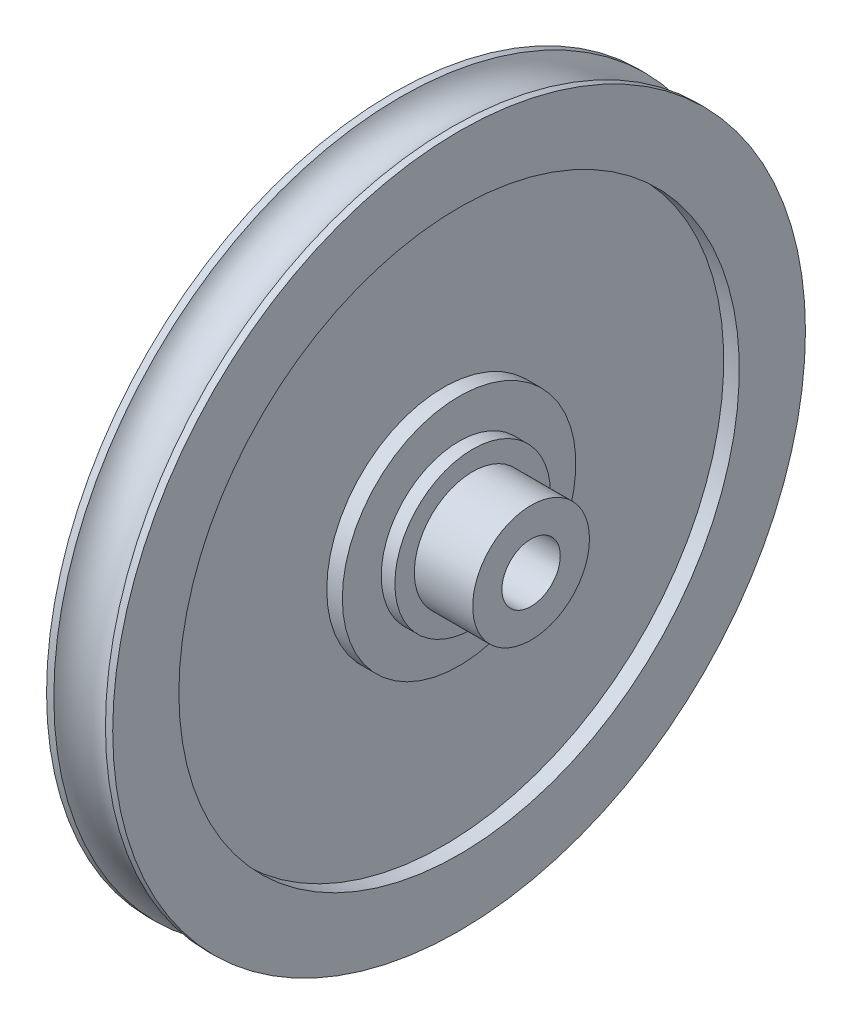
ISO-10303-21;
HEADER;
FILE_DESCRIPTION(('STEP AP214'),'2;1');
FILE_NAME('part.step','',(''),(''),'','','');
FILE_SCHEMA(('AUTOMOTIVE_DESIGN { 1 0 10303 214 1 1 1 1 }'));
ENDSEC;
DATA;
#1=APPLICATION_CONTEXT('core data for automotive mechanical design processes');
#2=APPLICATION_PROTOCOL_DEFINITION('international standard','automotive_design',2000,#1);
#3=PRODUCT_CONTEXT('',#1,'mechanical');
#4=PRODUCT('Part','Part','',(#3));
#5=PRODUCT_RELATED_PRODUCT_CATEGORY('part','',(#4));
#6=PRODUCT_DEFINITION_FORMATION('','',#4);
#7=PRODUCT_DEFINITION_CONTEXT('part definition',#1,'design');
#8=PRODUCT_DEFINITION('design','',#6,#7);
#9=PRODUCT_DEFINITION_SHAPE('','',#8);
#10=(LENGTH_UNIT() NAMED_UNIT(*) SI_UNIT(.MILLI.,.METRE.));
#11=(NAMED_UNIT(*) PLANE_ANGLE_UNIT() SI_UNIT($,.RADIAN.));
#12=(NAMED_UNIT(*) SI_UNIT($,.STERADIAN.) SOLID_ANGLE_UNIT());
#13=UNCERTAINTY_MEASURE_WITH_UNIT(LENGTH_MEASURE(1.E-05),#10,'distance_accuracy_value','');
#14=(GEOMETRIC_REPRESENTATION_CONTEXT(3) GLOBAL_UNCERTAINTY_ASSIGNED_CONTEXT((#13)) GLOBAL_UNIT_ASSIGNED_CONTEXT((#10,
#11,#12)) REPRESENTATION_CONTEXT('',''));
#15=CARTESIAN_POINT('',(0.,0.,0.));
#16=DIRECTION('',(0.,0.,1.));
#17=DIRECTION('',(1.,0.,0.));
#18=AXIS2_PLACEMENT_3D('',#15,#16,#17);
#19=CARTESIAN_POINT('',(-1.7,0.,0.));
#20=DIRECTION('',(1.,0.,0.));
#21=DIRECTION('',(0.,0.,-1.));
#22=AXIS2_PLACEMENT_3D('',#19,#20,#21);
#23=PLANE('',#22);
#24=CARTESIAN_POINT('',(-1.7,0.,0.));
#25=DIRECTION('',(1.,0.,0.));
#26=DIRECTION('',(0.,0.,-1.));
#27=AXIS2_PLACEMENT_3D('',#24,#25,#26);
#28=CIRCLE('',#27,4.);
#29=CARTESIAN_POINT('',(-1.7,0.,-4.));
#30=VERTEX_POINT('',#29);
#31=EDGE_CURVE('E85',#30,#30,#28,.T.);
#32=ORIENTED_EDGE('',*,*,#31,.T.);
#33=EDGE_LOOP('',(#32));
#34=FACE_BOUND('',#33,.T.);
#35=CARTESIAN_POINT('',(-1.7,0.,0.));
#36=DIRECTION('',(1.,0.,0.));
#37=DIRECTION('',(0.,0.,-1.));
#38=AXIS2_PLACEMENT_3D('',#35,#36,#37);
#39=CIRCLE('',#38,17.8);
#40=CARTESIAN_POINT('',(-1.7,0.,-17.8));
#41=VERTEX_POINT('',#40);
#42=EDGE_CURVE('E105',#41,#41,#39,.T.);
#43=ORIENTED_EDGE('',*,*,#42,.F.);
#44=EDGE_LOOP('',(#43));
#45=FACE_BOUND('',#44,.T.);
#46=ADVANCED_FACE('F38',(#34,#45),#23,.F.);
#47=CARTESIAN_POINT('',(1.7,0.,0.));
#48=DIRECTION('',(-1.,0.,0.));
#49=DIRECTION('',(0.,0.,1.));
#50=AXIS2_PLACEMENT_3D('',#47,#48,#49);
#51=PLANE('',#50);
#52=CARTESIAN_POINT('',(1.7,0.,0.));
#53=DIRECTION('',(-1.,0.,0.));
#54=DIRECTION('',(0.,0.,1.));
#55=AXIS2_PLACEMENT_3D('',#52,#53,#54);
#56=CIRCLE('',#55,14.4);
#57=CARTESIAN_POINT('',(1.7,0.,14.4));
#58=VERTEX_POINT('',#57);
#59=EDGE_CURVE('E69',#58,#58,#56,.T.);
#60=ORIENTED_EDGE('',*,*,#59,.T.);
#61=EDGE_LOOP('',(#60));
#62=FACE_BOUND('',#61,.T.);
#63=CARTESIAN_POINT('',(1.7,0.,0.));
#64=DIRECTION('',(-1.,0.,0.));
#65=DIRECTION('',(0.,0.,1.));
#66=AXIS2_PLACEMENT_3D('',#63,#64,#65);
#67=CIRCLE('',#66,17.8);
#68=CARTESIAN_POINT('',(1.7,0.,17.8));
#69=VERTEX_POINT('',#68);
#70=EDGE_CURVE('E42',#69,#69,#67,.T.);
#71=ORIENTED_EDGE('',*,*,#70,.F.);
#72=EDGE_LOOP('',(#71));
#73=FACE_BOUND('',#72,.T.);
#74=ADVANCED_FACE('F117',(#62,#73),#51,.F.);
#75=CARTESIAN_POINT('',(1.7,0.,0.));
#76=DIRECTION('',(-1.,0.,0.));
#77=DIRECTION('',(0.,0.,1.));
#78=AXIS2_PLACEMENT_3D('',#75,#76,#77);
#79=PLANE('',#78);
#80=CARTESIAN_POINT('',(1.7,0.,0.));
#81=DIRECTION('',(-1.,0.,0.));
#82=DIRECTION('',(0.,0.,1.));
#83=AXIS2_PLACEMENT_3D('',#80,#81,#82);
#84=CIRCLE('',#83,6.);
#85=CARTESIAN_POINT('',(1.7,0.,6.));
#86=VERTEX_POINT('',#85);
#87=EDGE_CURVE('E57',#86,#86,#84,.T.);
#88=ORIENTED_EDGE('',*,*,#87,.F.);
#89=EDGE_LOOP('',(#88));
#90=FACE_BOUND('',#89,.T.);
#91=CARTESIAN_POINT('',(1.7,0.,0.));
#92=DIRECTION('',(-1.,0.,0.));
#93=DIRECTION('',(0.,0.,1.));
#94=AXIS2_PLACEMENT_3D('',#91,#92,#93);
#95=CIRCLE('',#94,4.);
#96=CARTESIAN_POINT('',(1.7,0.,4.));
#97=VERTEX_POINT('',#96);
#98=EDGE_CURVE('E46',#97,#97,#95,.F.);
#99=ORIENTED_EDGE('',*,*,#98,.F.);
#100=EDGE_LOOP('',(#99));
#101=FACE_BOUND('',#100,.T.);
#102=ADVANCED_FACE('F119',(#90,#101),#79,.F.);
#103=CARTESIAN_POINT('',(-1.7,0.,0.));
#104=DIRECTION('',(-1.,0.,0.));
#105=DIRECTION('',(0.,0.,1.));
#106=AXIS2_PLACEMENT_3D('',#103,#104,#105);
#107=CYLINDRICAL_SURFACE('',#106,6.);
#108=CARTESIAN_POINT('',(0.9,0.,0.));
#109=DIRECTION('',(-1.,0.,0.));
#110=DIRECTION('',(0.,0.,1.));
#111=AXIS2_PLACEMENT_3D('',#108,#109,#110);
#112=CIRCLE('',#111,6.);
#113=CARTESIAN_POINT('',(0.9,0.,6.));
#114=VERTEX_POINT('',#113);
#115=EDGE_CURVE('E61',#114,#114,#112,.T.);
#116=ORIENTED_EDGE('',*,*,#115,.F.);
#117=EDGE_LOOP('',(#116));
#118=FACE_BOUND('',#117,.T.);
#119=ORIENTED_EDGE('',*,*,#87,.T.);
#120=EDGE_LOOP('',(#119));
#121=FACE_BOUND('',#120,.T.);
#122=ADVANCED_FACE('F127',(#118,#121),#107,.T.);
#123=CARTESIAN_POINT('',(0.9,0.,0.));
#124=DIRECTION('',(-1.,0.,0.));
#125=DIRECTION('',(0.,0.,1.));
#126=AXIS2_PLACEMENT_3D('',#123,#124,#125);
#127=PLANE('',#126);
#128=CARTESIAN_POINT('',(0.9,0.,0.));
#129=DIRECTION('',(-1.,0.,0.));
#130=DIRECTION('',(0.,0.,1.));
#131=AXIS2_PLACEMENT_3D('',#128,#129,#130);
#132=CIRCLE('',#131,14.4);
#133=CARTESIAN_POINT('',(0.9,0.,14.4));
#134=VERTEX_POINT('',#133);
#135=EDGE_CURVE('E65',#134,#134,#132,.T.);
#136=ORIENTED_EDGE('',*,*,#135,.F.);
#137=EDGE_LOOP('',(#136));
#138=FACE_BOUND('',#137,.T.);
#139=ORIENTED_EDGE('',*,*,#115,.T.);
#140=EDGE_LOOP('',(#139));
#141=FACE_BOUND('',#140,.T.);
#142=ADVANCED_FACE('F140',(#138,#141),#127,.F.);
#143=CARTESIAN_POINT('',(-1.7,0.,0.));
#144=DIRECTION('',(-1.,0.,0.));
#145=DIRECTION('',(0.,0.,1.));
#146=AXIS2_PLACEMENT_3D('',#143,#144,#145);
#147=CYLINDRICAL_SURFACE('',#146,14.4);
#148=ORIENTED_EDGE('',*,*,#59,.F.);
#149=EDGE_LOOP('',(#148));
#150=FACE_BOUND('',#149,.T.);
#151=ORIENTED_EDGE('',*,*,#135,.T.);
#152=EDGE_LOOP('',(#151));
#153=FACE_BOUND('',#152,.T.);
#154=ADVANCED_FACE('F136',(#150,#153),#147,.F.);
#155=CARTESIAN_POINT('',(2.4,0.,0.));
#156=DIRECTION('',(-1.,0.,0.));
#157=DIRECTION('',(0.,0.,1.));
#158=AXIS2_PLACEMENT_3D('',#155,#156,#157);
#159=CYLINDRICAL_SURFACE('',#158,4.);
#160=CARTESIAN_POINT('',(2.4,0.,0.));
#161=DIRECTION('',(1.,0.,0.));
#162=DIRECTION('',(0.,0.,-1.));
#163=AXIS2_PLACEMENT_3D('',#160,#161,#162);
#164=CIRCLE('',#163,4.);
#165=CARTESIAN_POINT('',(2.4,0.,-4.));
#166=VERTEX_POINT('',#165);
#167=EDGE_CURVE('E80',#166,#166,#164,.T.);
#168=ORIENTED_EDGE('',*,*,#167,.F.);
#169=EDGE_LOOP('',(#168));
#170=FACE_BOUND('',#169,.T.);
#171=ORIENTED_EDGE('',*,*,#98,.T.);
#172=EDGE_LOOP('',(#171));
#173=FACE_BOUND('',#172,.T.);
#174=ADVANCED_FACE('F139',(#170,#173),#159,.T.);
#175=CARTESIAN_POINT('',(2.4,0.,0.));
#176=DIRECTION('',(1.,0.,0.));
#177=DIRECTION('',(0.,0.,-1.));
#178=AXIS2_PLACEMENT_3D('',#175,#176,#177);
#179=PLANE('',#178);
#180=CARTESIAN_POINT('',(2.4,0.,0.));
#181=DIRECTION('',(1.,0.,0.));
#182=DIRECTION('',(0.,0.,-1.));
#183=AXIS2_PLACEMENT_3D('',#180,#181,#182);
#184=CIRCLE('',#183,3.);
#185=CARTESIAN_POINT('',(2.4,0.,-3.));
#186=VERTEX_POINT('',#185);
#187=EDGE_CURVE('E51',#186,#186,#184,.F.);
#188=ORIENTED_EDGE('',*,*,#187,.T.);
#189=EDGE_LOOP('',(#188));
#190=FACE_BOUND('',#189,.T.);
#191=ORIENTED_EDGE('',*,*,#167,.T.);
#192=EDGE_LOOP('',(#191));
#193=FACE_BOUND('',#192,.T.);
#194=ADVANCED_FACE('F157',(#190,#193),#179,.T.);
#195=CARTESIAN_POINT('',(5.4,0.,0.));
#196=DIRECTION('',(1.,0.,0.));
#197=DIRECTION('',(0.,0.,-1.));
#198=AXIS2_PLACEMENT_3D('',#195,#196,#197);
#199=PLANE('',#198);
#200=CARTESIAN_POINT('',(5.4,0.,0.));
#201=DIRECTION('',(1.,0.,0.));
#202=DIRECTION('',(0.,0.,-1.));
#203=AXIS2_PLACEMENT_3D('',#200,#201,#202);
#204=CIRCLE('',#203,1.5);
#205=CARTESIAN_POINT('',(5.4,0.,-1.5));
#206=VERTEX_POINT('',#205);
#207=EDGE_CURVE('E93',#206,#206,#204,.T.);
#208=ORIENTED_EDGE('',*,*,#207,.F.);
#209=EDGE_LOOP('',(#208));
#210=FACE_BOUND('',#209,.T.);
#211=CARTESIAN_POINT('',(5.4,0.,0.));
#212=DIRECTION('',(1.,0.,0.));
#213=DIRECTION('',(0.,0.,-1.));
#214=AXIS2_PLACEMENT_3D('',#211,#212,#213);
#215=CIRCLE('',#214,3.);
#216=CARTESIAN_POINT('',(5.4,0.,-3.));
#217=VERTEX_POINT('',#216);
#218=EDGE_CURVE('E76',#217,#217,#215,.T.);
#219=ORIENTED_EDGE('',*,*,#218,.T.);
#220=EDGE_LOOP('',(#219));
#221=FACE_BOUND('',#220,.T.);
#222=ADVANCED_FACE('F163',(#210,#221),#199,.T.);
#223=CARTESIAN_POINT('',(-5.4,0.,0.));
#224=DIRECTION('',(1.,0.,0.));
#225=DIRECTION('',(0.,0.,-1.));
#226=AXIS2_PLACEMENT_3D('',#223,#224,#225);
#227=CYLINDRICAL_SURFACE('',#226,3.);
#228=CARTESIAN_POINT('',(2.4,0.,-3.));
#229=CARTESIAN_POINT('',(2.43125,0.,-3.));
#230=CARTESIAN_POINT('',(2.4625,0.,-3.));
#231=CARTESIAN_POINT('',(2.525,0.,-3.));
#232=CARTESIAN_POINT('',(2.55625,0.,-3.));
#233=CARTESIAN_POINT('',(2.61875,0.,-3.));
#234=CARTESIAN_POINT('',(2.65,0.,-3.));
#235=CARTESIAN_POINT('',(2.7125,0.,-3.));
#236=CARTESIAN_POINT('',(2.74375,0.,-3.));
#237=CARTESIAN_POINT('',(2.80625,0.,-3.));
#238=CARTESIAN_POINT('',(2.8375,0.,-3.));
#239=CARTESIAN_POINT('',(2.9,0.,-3.));
#240=CARTESIAN_POINT('',(2.93125,0.,-3.));
#241=CARTESIAN_POINT('',(2.99375,0.,-3.));
#242=CARTESIAN_POINT('',(3.025,0.,-3.));
#243=CARTESIAN_POINT('',(3.0875,0.,-3.));
#244=CARTESIAN_POINT('',(3.11875,0.,-3.));
#245=CARTESIAN_POINT('',(3.18125,0.,-3.));
#246=CARTESIAN_POINT('',(3.2125,0.,-3.));
#247=CARTESIAN_POINT('',(3.275,0.,-3.));
#248=CARTESIAN_POINT('',(3.30625,0.,-3.));
#249=CARTESIAN_POINT('',(3.36875,0.,-3.));
#250=CARTESIAN_POINT('',(3.4,0.,-3.));
#251=CARTESIAN_POINT('',(3.4625,0.,-3.));
#252=CARTESIAN_POINT('',(3.49375,0.,-3.));
#253=CARTESIAN_POINT('',(3.55625,0.,-3.));
#254=CARTESIAN_POINT('',(3.5875,0.,-3.));
#255=CARTESIAN_POINT('',(3.65,0.,-3.));
#256=CARTESIAN_POINT('',(3.68125,0.,-3.));
#257=CARTESIAN_POINT('',(3.74375,0.,-3.));
#258=CARTESIAN_POINT('',(3.775,0.,-3.));
#259=CARTESIAN_POINT('',(3.8375,0.,-3.));
#260=CARTESIAN_POINT('',(3.86875,0.,-3.));
#261=CARTESIAN_POINT('',(3.93125,0.,-3.));
#262=CARTESIAN_POINT('',(3.9625,0.,-3.));
#263=CARTESIAN_POINT('',(4.025,0.,-3.));
#264=CARTESIAN_POINT('',(4.05625,0.,-3.));
#265=CARTESIAN_POINT('',(4.11875,0.,-3.));
#266=CARTESIAN_POINT('',(4.15,0.,-3.));
#267=CARTESIAN_POINT('',(4.2125,0.,-3.));
#268=CARTESIAN_POINT('',(4.24375,0.,-3.));
#269=CARTESIAN_POINT('',(4.30625,0.,-3.));
#270=CARTESIAN_POINT('',(4.3375,0.,-3.));
#271=CARTESIAN_POINT('',(4.4,0.,-3.));
#272=CARTESIAN_POINT('',(4.43125,0.,-3.));
#273=CARTESIAN_POINT('',(4.49375,0.,-3.));
#274=CARTESIAN_POINT('',(4.525,0.,-3.));
#275=CARTESIAN_POINT('',(4.5875,0.,-3.));
#276=CARTESIAN_POINT('',(4.61875,0.,-3.));
#277=CARTESIAN_POINT('',(4.68125,0.,-3.));
#278=CARTESIAN_POINT('',(4.7125,0.,-3.));
#279=CARTESIAN_POINT('',(4.775,0.,-3.));
#280=CARTESIAN_POINT('',(4.80625,0.,-3.));
#281=CARTESIAN_POINT('',(4.86875,0.,-3.));
#282=CARTESIAN_POINT('',(4.9,0.,-3.));
#283=CARTESIAN_POINT('',(4.9625,0.,-3.));
#284=CARTESIAN_POINT('',(4.99375,0.,-3.));
#285=CARTESIAN_POINT('',(5.05625,0.,-3.));
#286=CARTESIAN_POINT('',(5.0875,0.,-3.));
#287=CARTESIAN_POINT('',(5.15,0.,-3.));
#288=CARTESIAN_POINT('',(5.18125,0.,-3.));
#289=CARTESIAN_POINT('',(5.24375,0.,-3.));
#290=CARTESIAN_POINT('',(5.275,0.,-3.));
#291=CARTESIAN_POINT('',(5.3375,0.,-3.));
#292=CARTESIAN_POINT('',(5.36875,0.,-3.));
#293=CARTESIAN_POINT('',(5.4,0.,-3.));
#294=B_SPLINE_CURVE_WITH_KNOTS('',3,(#228,#229,#230,#231,#232,#233,#234,#235,#236,#237,#238,
#239,#240,#241,#242,#243,#244,#245,#246,#247,#248,#249,#250,#251,#252,#253,#254,#255,#256,#257,
#258,#259,#260,#261,#262,#263,#264,#265,#266,#267,#268,#269,#270,#271,#272,#273,#274,#275,#276,
#277,#278,#279,#280,#281,#282,#283,#284,#285,#286,#287,#288,#289,#290,#291,#292,#293),
.UNSPECIFIED.,.F.,.F.,(4,2,2,2,2,2,2,2,2,2,2,2,2,2,2,2,2,2,2,2,2,2,2,2,2,2,2,2,2,2,2,2,4),(0.,
0.0937499999999992,0.187499999999999,0.281249999999999,0.374999999999999,0.46875,0.5625,0.65625,
0.75,0.84375,0.9375,1.03125,1.125,1.21875,1.3125,1.40625,1.5,1.59375,1.6875,1.78125,1.875,
1.96875,2.0625,2.15625,2.25,2.34375,2.4375,2.53125,2.625,2.71875,2.8125,2.90625,3.),.UNSPECIFIED.);
#295=EDGE_CURVE('BSEAM170',#186,#217,#294,.T.);
#296=ORIENTED_EDGE('',*,*,#187,.F.);
#297=ORIENTED_EDGE('',*,*,#218,.F.);
#298=ORIENTED_EDGE('',*,*,#295,.T.);
#299=ORIENTED_EDGE('',*,*,#295,.F.);
#300=EDGE_LOOP('',(#296,#298,#297,#299));
#301=FACE_BOUND('',#300,.T.);
#302=ADVANCED_FACE('F170',(#301),#227,.T.);
#303=CARTESIAN_POINT('',(-2.4,0.,0.));
#304=DIRECTION('',(1.,0.,0.));
#305=DIRECTION('',(0.,0.,-1.));
#306=AXIS2_PLACEMENT_3D('',#303,#304,#305);
#307=CYLINDRICAL_SURFACE('',#306,4.);
#308=CARTESIAN_POINT('',(-2.4,0.,0.));
#309=DIRECTION('',(1.,0.,0.));
#310=DIRECTION('',(0.,0.,-1.));
#311=AXIS2_PLACEMENT_3D('',#308,#309,#310);
#312=CIRCLE('',#311,4.);
#313=CARTESIAN_POINT('',(-2.4,0.,-4.));
#314=VERTEX_POINT('',#313);
#315=EDGE_CURVE('E84',#314,#314,#312,.T.);
#316=ORIENTED_EDGE('',*,*,#315,.T.);
#317=EDGE_LOOP('',(#316));
#318=FACE_BOUND('',#317,.T.);
#319=ORIENTED_EDGE('',*,*,#31,.F.);
#320=EDGE_LOOP('',(#319));
#321=FACE_BOUND('',#320,.T.);
#322=ADVANCED_FACE('F182',(#318,#321),#307,.T.);
#323=CARTESIAN_POINT('',(-2.4,0.,0.));
#324=DIRECTION('',(-1.,0.,0.));
#325=DIRECTION('',(0.,0.,-1.));
#326=AXIS2_PLACEMENT_3D('',#323,#324,#325);
#327=PLANE('',#326);
#328=CARTESIAN_POINT('',(-2.4,0.,0.));
#329=DIRECTION('',(-1.,0.,0.));
#330=DIRECTION('',(0.,0.,1.));
#331=AXIS2_PLACEMENT_3D('',#328,#329,#330);
#332=CIRCLE('',#331,3.);
#333=CARTESIAN_POINT('',(-2.4,0.,-3.));
#334=VERTEX_POINT('',#333);
#335=EDGE_CURVE('E10',#334,#334,#332,.F.);
#336=ORIENTED_EDGE('',*,*,#335,.T.);
#337=EDGE_LOOP('',(#336));
#338=FACE_BOUND('',#337,.T.);
#339=ORIENTED_EDGE('',*,*,#315,.F.);
#340=EDGE_LOOP('',(#339));
#341=FACE_BOUND('',#340,.T.);
#342=ADVANCED_FACE('F174',(#338,#341),#327,.T.);
#343=CARTESIAN_POINT('',(-5.4,0.,0.));
#344=DIRECTION('',(1.,0.,0.));
#345=DIRECTION('',(0.,0.,-1.));
#346=AXIS2_PLACEMENT_3D('',#343,#344,#345);
#347=PLANE('',#346);
#348=CARTESIAN_POINT('',(-5.4,0.,0.));
#349=DIRECTION('',(1.,0.,0.));
#350=DIRECTION('',(0.,0.,-1.));
#351=AXIS2_PLACEMENT_3D('',#348,#349,#350);
#352=CIRCLE('',#351,1.5);
#353=CARTESIAN_POINT('',(-5.4,0.,-1.5));
#354=VERTEX_POINT('',#353);
#355=EDGE_CURVE('E88',#354,#354,#352,.T.);
#356=ORIENTED_EDGE('',*,*,#355,.T.);
#357=EDGE_LOOP('',(#356));
#358=FACE_BOUND('',#357,.T.);
#359=CARTESIAN_POINT('',(-5.4,0.,0.));
#360=DIRECTION('',(1.,0.,0.));
#361=DIRECTION('',(0.,0.,-1.));
#362=AXIS2_PLACEMENT_3D('',#359,#360,#361);
#363=CIRCLE('',#362,3.);
#364=CARTESIAN_POINT('',(-5.4,0.,-3.));
#365=VERTEX_POINT('',#364);
#366=EDGE_CURVE('E73',#365,#365,#363,.T.);
#367=ORIENTED_EDGE('',*,*,#366,.F.);
#368=EDGE_LOOP('',(#367));
#369=FACE_BOUND('',#368,.T.);
#370=ADVANCED_FACE('F172',(#358,#369),#347,.F.);
#371=CARTESIAN_POINT('',(-2.4,0.,-3.));
#372=CARTESIAN_POINT('',(-2.43125,0.,-3.));
#373=CARTESIAN_POINT('',(-2.4625,0.,-3.));
#374=CARTESIAN_POINT('',(-2.525,0.,-3.));
#375=CARTESIAN_POINT('',(-2.55625,0.,-3.));
#376=CARTESIAN_POINT('',(-2.61875,0.,-3.));
#377=CARTESIAN_POINT('',(-2.65,0.,-3.));
#378=CARTESIAN_POINT('',(-2.7125,0.,-3.));
#379=CARTESIAN_POINT('',(-2.74375,0.,-3.));
#380=CARTESIAN_POINT('',(-2.80625,0.,-3.));
#381=CARTESIAN_POINT('',(-2.8375,0.,-3.));
#382=CARTESIAN_POINT('',(-2.9,0.,-3.));
#383=CARTESIAN_POINT('',(-2.93125,0.,-3.));
#384=CARTESIAN_POINT('',(-2.99375,0.,-3.));
#385=CARTESIAN_POINT('',(-3.025,0.,-3.));
#386=CARTESIAN_POINT('',(-3.0875,0.,-3.));
#387=CARTESIAN_POINT('',(-3.11875,0.,-3.));
#388=CARTESIAN_POINT('',(-3.18125,0.,-3.));
#389=CARTESIAN_POINT('',(-3.2125,0.,-3.));
#390=CARTESIAN_POINT('',(-3.275,0.,-3.));
#391=CARTESIAN_POINT('',(-3.30625,0.,-3.));
#392=CARTESIAN_POINT('',(-3.36875,0.,-3.));
#393=CARTESIAN_POINT('',(-3.4,0.,-3.));
#394=CARTESIAN_POINT('',(-3.4625,0.,-3.));
#395=CARTESIAN_POINT('',(-3.49375,0.,-3.));
#396=CARTESIAN_POINT('',(-3.55625,0.,-3.));
#397=CARTESIAN_POINT('',(-3.5875,0.,-3.));
#398=CARTESIAN_POINT('',(-3.65,0.,-3.));
#399=CARTESIAN_POINT('',(-3.68125,0.,-3.));
#400=CARTESIAN_POINT('',(-3.74375,0.,-3.));
#401=CARTESIAN_POINT('',(-3.775,0.,-3.));
#402=CARTESIAN_POINT('',(-3.8375,0.,-3.));
#403=CARTESIAN_POINT('',(-3.86875,0.,-3.));
#404=CARTESIAN_POINT('',(-3.93125,0.,-3.));
#405=CARTESIAN_POINT('',(-3.9625,0.,-3.));
#406=CARTESIAN_POINT('',(-4.025,0.,-3.));
#407=CARTESIAN_POINT('',(-4.05625,0.,-3.));
#408=CARTESIAN_POINT('',(-4.11875,0.,-3.));
#409=CARTESIAN_POINT('',(-4.15,0.,-3.));
#410=CARTESIAN_POINT('',(-4.2125,0.,-3.));
#411=CARTESIAN_POINT('',(-4.24375,0.,-3.));
#412=CARTESIAN_POINT('',(-4.30625,0.,-3.));
#413=CARTESIAN_POINT('',(-4.3375,0.,-3.));
#414=CARTESIAN_POINT('',(-4.4,0.,-3.));
#415=CARTESIAN_POINT('',(-4.43125,0.,-3.));
#416=CARTESIAN_POINT('',(-4.49375,0.,-3.));
#417=CARTESIAN_POINT('',(-4.525,0.,-3.));
#418=CARTESIAN_POINT('',(-4.5875,0.,-3.));
#419=CARTESIAN_POINT('',(-4.61875,0.,-3.));
#420=CARTESIAN_POINT('',(-4.68125,0.,-3.));
#421=CARTESIAN_POINT('',(-4.7125,0.,-3.));
#422=CARTESIAN_POINT('',(-4.775,0.,-3.));
#423=CARTESIAN_POINT('',(-4.80625,0.,-3.));
#424=CARTESIAN_POINT('',(-4.86875,0.,-3.));
#425=CARTESIAN_POINT('',(-4.9,0.,-3.));
#426=CARTESIAN_POINT('',(-4.9625,0.,-3.));
#427=CARTESIAN_POINT('',(-4.99375,0.,-3.));
#428=CARTESIAN_POINT('',(-5.05625,0.,-3.));
#429=CARTESIAN_POINT('',(-5.0875,0.,-3.));
#430=CARTESIAN_POINT('',(-5.15,0.,-3.));
#431=CARTESIAN_POINT('',(-5.18125,0.,-3.));
#432=CARTESIAN_POINT('',(-5.24375,0.,-3.));
#433=CARTESIAN_POINT('',(-5.275,0.,-3.));
#434=CARTESIAN_POINT('',(-5.3375,0.,-3.));
#435=CARTESIAN_POINT('',(-5.36875,0.,-3.));
#436=CARTESIAN_POINT('',(-5.4,0.,-3.));
#437=B_SPLINE_CURVE_WITH_KNOTS('',3,(#371,#372,#373,#374,#375,#376,#377,#378,#379,#380,#381,
#382,#383,#384,#385,#386,#387,#388,#389,#390,#391,#392,#393,#394,#395,#396,#397,#398,#399,#400,
#401,#402,#403,#404,#405,#406,#407,#408,#409,#410,#411,#412,#413,#414,#415,#416,#417,#418,#419,
#420,#421,#422,#423,#424,#425,#426,#427,#428,#429,#430,#431,#432,#433,#434,#435,#436),
.UNSPECIFIED.,.F.,.F.,(4,2,2,2,2,2,2,2,2,2,2,2,2,2,2,2,2,2,2,2,2,2,2,2,2,2,2,2,2,2,2,2,4),(0.,
0.0937500000000001,0.1875,0.28125,0.375,0.46875,0.5625,0.65625,0.75,0.84375,0.9375,1.03125,
1.125,1.21875,1.3125,1.40625,1.5,1.59375,1.6875,1.78125,1.875,1.96875,2.0625,2.15625,2.25,
2.34375,2.4375,2.53125,2.625,2.71875,2.8125,2.90625,3.),.UNSPECIFIED.);
#438=EDGE_CURVE('BSEAM134',#334,#365,#437,.T.);
#439=ORIENTED_EDGE('',*,*,#335,.F.);
#440=ORIENTED_EDGE('',*,*,#366,.T.);
#441=ORIENTED_EDGE('',*,*,#438,.T.);
#442=ORIENTED_EDGE('',*,*,#438,.F.);
#443=EDGE_LOOP('',(#439,#441,#440,#442));
#444=FACE_BOUND('',#443,.T.);
#445=ADVANCED_FACE('F134',(#444),#227,.T.);
#446=CARTESIAN_POINT('',(-5.4,0.,0.));
#447=DIRECTION('',(1.,0.,0.));
#448=DIRECTION('',(0.,0.,-1.));
#449=AXIS2_PLACEMENT_3D('',#446,#447,#448);
#450=CYLINDRICAL_SURFACE('',#449,1.5);
#451=CARTESIAN_POINT('',(-5.4,0.,-1.5));
#452=CARTESIAN_POINT('',(-5.2875,0.,-1.5));
#453=CARTESIAN_POINT('',(-5.175,0.,-1.5));
#454=CARTESIAN_POINT('',(-4.95,0.,-1.5));
#455=CARTESIAN_POINT('',(-4.8375,0.,-1.5));
#456=CARTESIAN_POINT('',(-4.6125,0.,-1.5));
#457=CARTESIAN_POINT('',(-4.5,0.,-1.5));
#458=CARTESIAN_POINT('',(-4.275,0.,-1.5));
#459=CARTESIAN_POINT('',(-4.1625,0.,-1.5));
#460=CARTESIAN_POINT('',(-3.9375,0.,-1.5));
#461=CARTESIAN_POINT('',(-3.825,0.,-1.5));
#462=CARTESIAN_POINT('',(-3.6,0.,-1.5));
#463=CARTESIAN_POINT('',(-3.4875,0.,-1.5));
#464=CARTESIAN_POINT('',(-3.2625,0.,-1.5));
#465=CARTESIAN_POINT('',(-3.15,0.,-1.5));
#466=CARTESIAN_POINT('',(-2.925,0.,-1.5));
#467=CARTESIAN_POINT('',(-2.8125,0.,-1.5));
#468=CARTESIAN_POINT('',(-2.5875,0.,-1.5));
#469=CARTESIAN_POINT('',(-2.475,0.,-1.5));
#470=CARTESIAN_POINT('',(-2.25,0.,-1.5));
#471=CARTESIAN_POINT('',(-2.1375,0.,-1.5));
#472=CARTESIAN_POINT('',(-1.9125,0.,-1.5));
#473=CARTESIAN_POINT('',(-1.8,0.,-1.5));
#474=CARTESIAN_POINT('',(-1.575,0.,-1.5));
#475=CARTESIAN_POINT('',(-1.4625,0.,-1.5));
#476=CARTESIAN_POINT('',(-1.2375,0.,-1.5));
#477=CARTESIAN_POINT('',(-1.125,0.,-1.5));
#478=CARTESIAN_POINT('',(-0.900000000000002,0.,-1.5));
#479=CARTESIAN_POINT('',(-0.787500000000002,0.,-1.5));
#480=CARTESIAN_POINT('',(-0.562500000000002,0.,-1.5));
#481=CARTESIAN_POINT('',(-0.450000000000002,0.,-1.5));
#482=CARTESIAN_POINT('',(-0.225000000000002,0.,-1.5));
#483=CARTESIAN_POINT('',(-0.112500000000002,0.,-1.5));
#484=CARTESIAN_POINT('',(0.112499999999998,0.,-1.5));
#485=CARTESIAN_POINT('',(0.224999999999998,0.,-1.5));
#486=CARTESIAN_POINT('',(0.449999999999998,0.,-1.5));
#487=CARTESIAN_POINT('',(0.562499999999998,0.,-1.5));
#488=CARTESIAN_POINT('',(0.787499999999999,0.,-1.5));
#489=CARTESIAN_POINT('',(0.899999999999999,0.,-1.5));
#490=CARTESIAN_POINT('',(1.125,0.,-1.5));
#491=CARTESIAN_POINT('',(1.2375,0.,-1.5));
#492=CARTESIAN_POINT('',(1.4625,0.,-1.5));
#493=CARTESIAN_POINT('',(1.575,0.,-1.5));
#494=CARTESIAN_POINT('',(1.8,0.,-1.5));
#495=CARTESIAN_POINT('',(1.9125,0.,-1.5));
#496=CARTESIAN_POINT('',(2.1375,0.,-1.5));
#497=CARTESIAN_POINT('',(2.25,0.,-1.5));
#498=CARTESIAN_POINT('',(2.475,0.,-1.5));
#499=CARTESIAN_POINT('',(2.5875,0.,-1.5));
#500=CARTESIAN_POINT('',(2.8125,0.,-1.5));
#501=CARTESIAN_POINT('',(2.925,0.,-1.5));
#502=CARTESIAN_POINT('',(3.15,0.,-1.5));
#503=CARTESIAN_POINT('',(3.2625,0.,-1.5));
#504=CARTESIAN_POINT('',(3.4875,0.,-1.5));
#505=CARTESIAN_POINT('',(3.6,0.,-1.5));
#506=CARTESIAN_POINT('',(3.825,0.,-1.5));
#507=CARTESIAN_POINT('',(3.9375,0.,-1.5));
#508=CARTESIAN_POINT('',(4.1625,0.,-1.5));
#509=CARTESIAN_POINT('',(4.275,0.,-1.5));
#510=CARTESIAN_POINT('',(4.5,0.,-1.5));
#511=CARTESIAN_POINT('',(4.6125,0.,-1.5));
#512=CARTESIAN_POINT('',(4.8375,0.,-1.5));
#513=CARTESIAN_POINT('',(4.95,0.,-1.5));
#514=CARTESIAN_POINT('',(5.175,0.,-1.5));
#515=CARTESIAN_POINT('',(5.2875,0.,-1.5));
#516=CARTESIAN_POINT('',(5.4,0.,-1.5));
#517=B_SPLINE_CURVE_WITH_KNOTS('',3,(#451,#452,#453,#454,#455,#456,#457,#458,#459,#460,#461,
#462,#463,#464,#465,#466,#467,#468,#469,#470,#471,#472,#473,#474,#475,#476,#477,#478,#479,#480,
#481,#482,#483,#484,#485,#486,#487,#488,#489,#490,#491,#492,#493,#494,#495,#496,#497,#498,#499,
#500,#501,#502,#503,#504,#505,#506,#507,#508,#509,#510,#511,#512,#513,#514,#515,#516),
.UNSPECIFIED.,.F.,.F.,(4,2,2,2,2,2,2,2,2,2,2,2,2,2,2,2,2,2,2,2,2,2,2,2,2,2,2,2,2,2,2,2,4),(0.,
0.3375,0.675,1.0125,1.35,1.6875,2.025,2.3625,2.7,3.0375,3.375,3.7125,4.05,4.3875,4.725,5.0625,
5.4,5.7375,6.075,6.4125,6.75,7.0875,7.425,7.7625,8.1,8.4375,8.775,9.1125,9.45,9.7875,10.125,
10.4625,10.8),.UNSPECIFIED.);
#518=EDGE_CURVE('BSEAM180',#354,#206,#517,.T.);
#519=ORIENTED_EDGE('',*,*,#355,.F.);
#520=ORIENTED_EDGE('',*,*,#207,.T.);
#521=ORIENTED_EDGE('',*,*,#518,.T.);
#522=ORIENTED_EDGE('',*,*,#518,.F.);
#523=EDGE_LOOP('',(#519,#521,#520,#522));
#524=FACE_BOUND('',#523,.T.);
#525=ADVANCED_FACE('F180',(#524),#450,.F.);
#526=CARTESIAN_POINT('',(0.,0.,0.));
#527=DIRECTION('',(-1.,0.,0.));
#528=DIRECTION('',(0.,0.,1.));
#529=AXIS2_PLACEMENT_3D('',#526,#527,#528);
#530=CYLINDRICAL_SURFACE('',#529,17.8);
#531=ORIENTED_EDGE('',*,*,#70,.T.);
#532=EDGE_LOOP('',(#531));
#533=FACE_BOUND('',#532,.T.);
#534=CARTESIAN_POINT('',(1.32664991614216,0.,0.));
#535=DIRECTION('',(-1.,0.,0.));
#536=DIRECTION('',(0.,0.,1.));
#537=AXIS2_PLACEMENT_3D('',#534,#535,#536);
#538=CIRCLE('',#537,17.8);
#539=CARTESIAN_POINT('',(1.32664991614216,0.,17.8));
#540=VERTEX_POINT('',#539);
#541=EDGE_CURVE('E101',#540,#540,#538,.F.);
#542=ORIENTED_EDGE('',*,*,#541,.T.);
#543=EDGE_LOOP('',(#542));
#544=FACE_BOUND('',#543,.T.);
#545=ADVANCED_FACE('F114',(#533,#544),#530,.T.);
#546=ORIENTED_EDGE('',*,*,#42,.T.);
#547=EDGE_LOOP('',(#546));
#548=FACE_BOUND('',#547,.T.);
#549=CARTESIAN_POINT('',(-1.32664991614216,0.,0.));
#550=DIRECTION('',(1.,0.,0.));
#551=DIRECTION('',(0.,0.,-1.));
#552=AXIS2_PLACEMENT_3D('',#549,#550,#551);
#553=CIRCLE('',#552,17.8);
#554=CARTESIAN_POINT('',(-1.32664991614216,0.,-17.8));
#555=VERTEX_POINT('',#554);
#556=EDGE_CURVE('E97',#555,#555,#553,.F.);
#557=ORIENTED_EDGE('',*,*,#556,.T.);
#558=EDGE_LOOP('',(#557));
#559=FACE_BOUND('',#558,.T.);
#560=ADVANCED_FACE('F208',(#548,#559),#530,.T.);
#561=CARTESIAN_POINT('',(0.,0.,0.));
#562=DIRECTION('',(-1.,0.,0.));
#563=DIRECTION('',(0.,0.,1.));
#564=AXIS2_PLACEMENT_3D('',#561,#562,#563);
#565=TOROIDAL_SURFACE('',#564,18.5,1.5);
#566=ORIENTED_EDGE('',*,*,#541,.F.);
#567=EDGE_LOOP('',(#566));
#568=FACE_BOUND('',#567,.T.);
#569=ORIENTED_EDGE('',*,*,#556,.F.);
#570=EDGE_LOOP('',(#569));
#571=FACE_BOUND('',#570,.T.);
#572=ADVANCED_FACE('F40',(#568,#571),#565,.F.);
#573=CLOSED_SHELL('',(#46,#74,#102,#122,#142,#154,#174,#194,#222,#302,#322,#342,#370,#445,#525,
#545,#560,#572));
#574=MANIFOLD_SOLID_BREP('B2',#573);
#575=ADVANCED_BREP_SHAPE_REPRESENTATION('',(#18,#574),#14);
#576=SHAPE_DEFINITION_REPRESENTATION(#9,#575);
ENDSEC;
END-ISO-10303-21;
